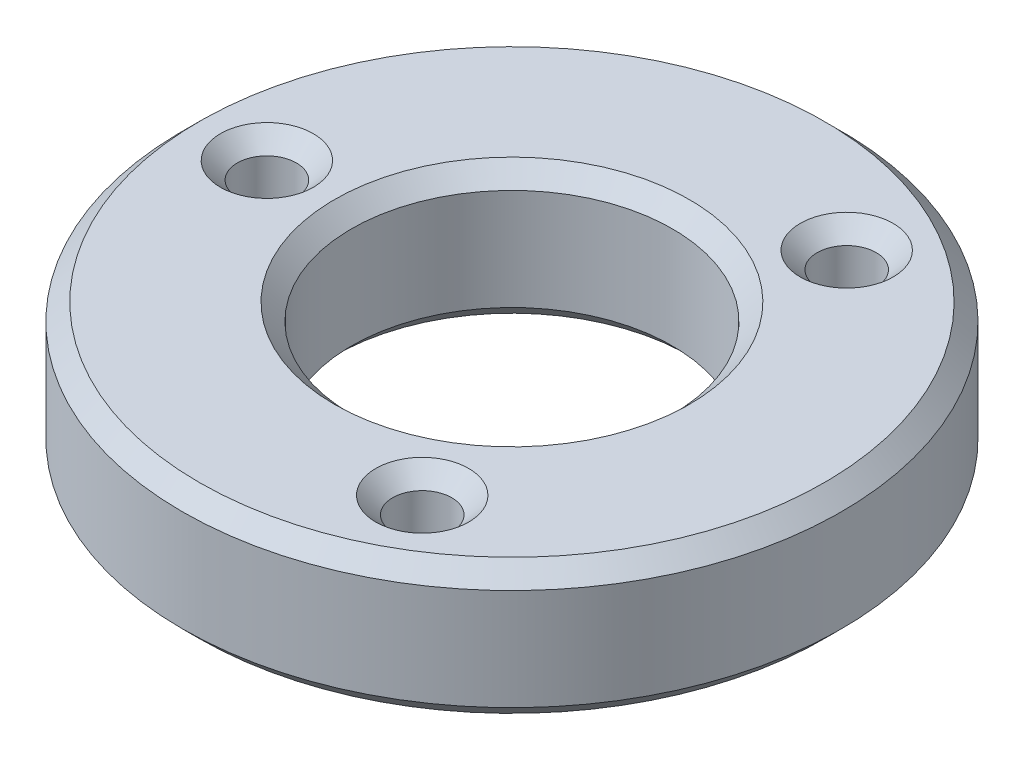
ISO-10303-21;
HEADER;
FILE_DESCRIPTION(('STEP AP214'),'2;1');
FILE_NAME('part.step','',(''),(''),'','','');
FILE_SCHEMA(('AUTOMOTIVE_DESIGN { 1 0 10303 214 1 1 1 1 }'));
ENDSEC;
DATA;
#1=APPLICATION_CONTEXT('core data for automotive mechanical design processes');
#2=APPLICATION_PROTOCOL_DEFINITION('international standard','automotive_design',2000,#1);
#3=PRODUCT_CONTEXT('',#1,'mechanical');
#4=PRODUCT('Part','Part','',(#3));
#5=PRODUCT_RELATED_PRODUCT_CATEGORY('part','',(#4));
#6=PRODUCT_DEFINITION_FORMATION('','',#4);
#7=PRODUCT_DEFINITION_CONTEXT('part definition',#1,'design');
#8=PRODUCT_DEFINITION('design','',#6,#7);
#9=PRODUCT_DEFINITION_SHAPE('','',#8);
#10=(LENGTH_UNIT() NAMED_UNIT(*) SI_UNIT(.MILLI.,.METRE.));
#11=(NAMED_UNIT(*) PLANE_ANGLE_UNIT() SI_UNIT($,.RADIAN.));
#12=(NAMED_UNIT(*) SI_UNIT($,.STERADIAN.) SOLID_ANGLE_UNIT());
#13=UNCERTAINTY_MEASURE_WITH_UNIT(LENGTH_MEASURE(1.E-05),#10,'distance_accuracy_value','');
#14=(GEOMETRIC_REPRESENTATION_CONTEXT(3) GLOBAL_UNCERTAINTY_ASSIGNED_CONTEXT((#13)) GLOBAL_UNIT_ASSIGNED_CONTEXT((#10,
#11,#12)) REPRESENTATION_CONTEXT('',''));
#15=CARTESIAN_POINT('',(0.,0.,0.));
#16=DIRECTION('',(0.,0.,1.));
#17=DIRECTION('',(1.,0.,0.));
#18=AXIS2_PLACEMENT_3D('',#15,#16,#17);
#19=CARTESIAN_POINT('',(0.,8.,0.));
#20=DIRECTION('',(0.,1.,0.));
#21=DIRECTION('',(0.,0.,1.));
#22=AXIS2_PLACEMENT_3D('',#19,#20,#21);
#23=PLANE('',#22);
#24=CARTESIAN_POINT('',(7.24999999999998,8.,12.5573683548744));
#25=DIRECTION('',(0.,1.,0.));
#26=DIRECTION('',(0.,0.,1.));
#27=AXIS2_PLACEMENT_3D('',#24,#25,#26);
#28=CIRCLE('',#27,2.75000000000005);
#29=CARTESIAN_POINT('',(7.24999999999998,8.,15.3073683548744));
#30=VERTEX_POINT('',#29);
#31=EDGE_CURVE('E10',#30,#30,#28,.F.);
#32=ORIENTED_EDGE('',*,*,#31,.T.);
#33=EDGE_LOOP('',(#32));
#34=FACE_BOUND('',#33,.T.);
#35=CARTESIAN_POINT('',(-14.5,8.,0.));
#36=DIRECTION('',(0.,1.,0.));
#37=DIRECTION('',(0.,0.,1.));
#38=AXIS2_PLACEMENT_3D('',#35,#36,#37);
#39=CIRCLE('',#38,2.75);
#40=CARTESIAN_POINT('',(-14.5,8.,2.75));
#41=VERTEX_POINT('',#40);
#42=EDGE_CURVE('E44',#41,#41,#39,.F.);
#43=ORIENTED_EDGE('',*,*,#42,.T.);
#44=EDGE_LOOP('',(#43));
#45=FACE_BOUND('',#44,.T.);
#46=CARTESIAN_POINT('',(0.,8.,0.));
#47=DIRECTION('',(0.,1.,0.));
#48=DIRECTION('',(0.,0.,1.));
#49=AXIS2_PLACEMENT_3D('',#46,#47,#48);
#50=CIRCLE('',#49,18.5);
#51=CARTESIAN_POINT('',(0.,8.,18.5));
#52=VERTEX_POINT('',#51);
#53=EDGE_CURVE('E48',#52,#52,#50,.T.);
#54=ORIENTED_EDGE('',*,*,#53,.T.);
#55=EDGE_LOOP('',(#54));
#56=FACE_BOUND('',#55,.T.);
#57=CARTESIAN_POINT('',(0.,8.,0.));
#58=DIRECTION('',(0.,1.,0.));
#59=DIRECTION('',(0.,0.,1.));
#60=AXIS2_PLACEMENT_3D('',#57,#58,#59);
#61=CIRCLE('',#60,10.5);
#62=CARTESIAN_POINT('',(0.,8.,10.5));
#63=VERTEX_POINT('',#62);
#64=EDGE_CURVE('E52',#63,#63,#61,.F.);
#65=ORIENTED_EDGE('',*,*,#64,.T.);
#66=EDGE_LOOP('',(#65));
#67=FACE_BOUND('',#66,.T.);
#68=CARTESIAN_POINT('',(7.25000000000002,8.,-12.5573683548743));
#69=DIRECTION('',(0.,1.,0.));
#70=DIRECTION('',(0.,0.,1.));
#71=AXIS2_PLACEMENT_3D('',#68,#69,#70);
#72=CIRCLE('',#71,2.75);
#73=CARTESIAN_POINT('',(7.25000000000002,8.,-9.80736835487433));
#74=VERTEX_POINT('',#73);
#75=EDGE_CURVE('E57',#74,#74,#72,.F.);
#76=ORIENTED_EDGE('',*,*,#75,.T.);
#77=EDGE_LOOP('',(#76));
#78=FACE_BOUND('',#77,.T.);
#79=ADVANCED_FACE('F36',(#34,#45,#56,#67,#78),#23,.T.);
#80=CARTESIAN_POINT('',(0.,0.,0.));
#81=DIRECTION('',(0.,1.,0.));
#82=DIRECTION('',(0.,0.,1.));
#83=AXIS2_PLACEMENT_3D('',#80,#81,#82);
#84=PLANE('',#83);
#85=CARTESIAN_POINT('',(7.24999999999998,0.,12.5573683548744));
#86=DIRECTION('',(0.,1.,0.));
#87=DIRECTION('',(0.,0.,1.));
#88=AXIS2_PLACEMENT_3D('',#85,#86,#87);
#89=CIRCLE('',#88,2.75000000000005);
#90=CARTESIAN_POINT('',(7.24999999999998,0.,15.3073683548744));
#91=VERTEX_POINT('',#90);
#92=EDGE_CURVE('E90',#91,#91,#89,.T.);
#93=ORIENTED_EDGE('',*,*,#92,.T.);
#94=EDGE_LOOP('',(#93));
#95=FACE_BOUND('',#94,.T.);
#96=CARTESIAN_POINT('',(7.25000000000002,0.,-12.5573683548743));
#97=DIRECTION('',(0.,1.,0.));
#98=DIRECTION('',(0.,0.,1.));
#99=AXIS2_PLACEMENT_3D('',#96,#97,#98);
#100=CIRCLE('',#99,2.74999999999998);
#101=CARTESIAN_POINT('',(7.25000000000002,0.,-9.80736835487434));
#102=VERTEX_POINT('',#101);
#103=EDGE_CURVE('E93',#102,#102,#100,.T.);
#104=ORIENTED_EDGE('',*,*,#103,.T.);
#105=EDGE_LOOP('',(#104));
#106=FACE_BOUND('',#105,.T.);
#107=CARTESIAN_POINT('',(-14.5,0.,0.));
#108=DIRECTION('',(0.,1.,0.));
#109=DIRECTION('',(0.,0.,1.));
#110=AXIS2_PLACEMENT_3D('',#107,#108,#109);
#111=CIRCLE('',#110,2.74999999999999);
#112=CARTESIAN_POINT('',(-14.5,0.,2.74999999999999));
#113=VERTEX_POINT('',#112);
#114=EDGE_CURVE('E96',#113,#113,#111,.T.);
#115=ORIENTED_EDGE('',*,*,#114,.T.);
#116=EDGE_LOOP('',(#115));
#117=FACE_BOUND('',#116,.T.);
#118=CARTESIAN_POINT('',(0.,0.,0.));
#119=DIRECTION('',(0.,1.,0.));
#120=DIRECTION('',(0.,0.,1.));
#121=AXIS2_PLACEMENT_3D('',#118,#119,#120);
#122=CIRCLE('',#121,10.5);
#123=CARTESIAN_POINT('',(0.,0.,10.5));
#124=VERTEX_POINT('',#123);
#125=EDGE_CURVE('E99',#124,#124,#122,.T.);
#126=ORIENTED_EDGE('',*,*,#125,.T.);
#127=EDGE_LOOP('',(#126));
#128=FACE_BOUND('',#127,.T.);
#129=CARTESIAN_POINT('',(0.,0.,0.));
#130=DIRECTION('',(0.,1.,0.));
#131=DIRECTION('',(0.,0.,1.));
#132=AXIS2_PLACEMENT_3D('',#129,#130,#131);
#133=CIRCLE('',#132,18.5);
#134=CARTESIAN_POINT('',(0.,0.,18.5));
#135=VERTEX_POINT('',#134);
#136=EDGE_CURVE('E102',#135,#135,#133,.F.);
#137=ORIENTED_EDGE('',*,*,#136,.T.);
#138=EDGE_LOOP('',(#137));
#139=FACE_BOUND('',#138,.T.);
#140=ADVANCED_FACE('F106',(#95,#106,#117,#128,#139),#84,.F.);
#141=CARTESIAN_POINT('',(0.,8.,0.));
#142=DIRECTION('',(0.,-1.,0.));
#143=DIRECTION('',(0.,0.,-1.));
#144=AXIS2_PLACEMENT_3D('',#141,#142,#143);
#145=CYLINDRICAL_SURFACE('',#144,19.5);
#146=CARTESIAN_POINT('',(0.,1.,0.));
#147=DIRECTION('',(0.,1.,0.));
#148=DIRECTION('',(0.,0.,1.));
#149=AXIS2_PLACEMENT_3D('',#146,#147,#148);
#150=CIRCLE('',#149,19.5);
#151=CARTESIAN_POINT('',(0.,1.,19.5));
#152=VERTEX_POINT('',#151);
#153=EDGE_CURVE('E60',#152,#152,#150,.T.);
#154=ORIENTED_EDGE('',*,*,#153,.T.);
#155=EDGE_LOOP('',(#154));
#156=FACE_BOUND('',#155,.T.);
#157=CARTESIAN_POINT('',(0.,6.99999999999999,0.));
#158=DIRECTION('',(0.,1.,0.));
#159=DIRECTION('',(0.,0.,1.));
#160=AXIS2_PLACEMENT_3D('',#157,#158,#159);
#161=CIRCLE('',#160,19.5);
#162=CARTESIAN_POINT('',(0.,6.99999999999999,19.5));
#163=VERTEX_POINT('',#162);
#164=EDGE_CURVE('E63',#163,#163,#161,.F.);
#165=ORIENTED_EDGE('',*,*,#164,.T.);
#166=EDGE_LOOP('',(#165));
#167=FACE_BOUND('',#166,.T.);
#168=ADVANCED_FACE('F116',(#156,#167),#145,.T.);
#169=CARTESIAN_POINT('',(0.,8.,0.));
#170=DIRECTION('',(0.,-1.,0.));
#171=DIRECTION('',(0.,0.,-1.));
#172=AXIS2_PLACEMENT_3D('',#169,#170,#171);
#173=CYLINDRICAL_SURFACE('',#172,9.5);
#174=CARTESIAN_POINT('',(0.,0.999999999999994,0.));
#175=DIRECTION('',(0.,1.,0.));
#176=DIRECTION('',(0.,0.,1.));
#177=AXIS2_PLACEMENT_3D('',#174,#175,#176);
#178=CIRCLE('',#177,9.5);
#179=CARTESIAN_POINT('',(0.,0.999999999999994,9.5));
#180=VERTEX_POINT('',#179);
#181=EDGE_CURVE('E66',#180,#180,#178,.F.);
#182=ORIENTED_EDGE('',*,*,#181,.T.);
#183=EDGE_LOOP('',(#182));
#184=FACE_BOUND('',#183,.T.);
#185=CARTESIAN_POINT('',(0.,7.,0.));
#186=DIRECTION('',(0.,1.,0.));
#187=DIRECTION('',(0.,0.,1.));
#188=AXIS2_PLACEMENT_3D('',#185,#186,#187);
#189=CIRCLE('',#188,9.5);
#190=CARTESIAN_POINT('',(0.,7.,9.5));
#191=VERTEX_POINT('',#190);
#192=EDGE_CURVE('E69',#191,#191,#189,.T.);
#193=ORIENTED_EDGE('',*,*,#192,.T.);
#194=EDGE_LOOP('',(#193));
#195=FACE_BOUND('',#194,.T.);
#196=ADVANCED_FACE('F119',(#184,#195),#173,.F.);
#197=CARTESIAN_POINT('',(-14.5,8.,0.));
#198=DIRECTION('',(0.,-1.,0.));
#199=DIRECTION('',(0.,0.,-1.));
#200=AXIS2_PLACEMENT_3D('',#197,#198,#199);
#201=CYLINDRICAL_SURFACE('',#200,1.75);
#202=CARTESIAN_POINT('',(-14.5,0.999999999999997,0.));
#203=DIRECTION('',(0.,1.,0.));
#204=DIRECTION('',(0.,0.,1.));
#205=AXIS2_PLACEMENT_3D('',#202,#203,#204);
#206=CIRCLE('',#205,1.75);
#207=CARTESIAN_POINT('',(-14.5,0.999999999999997,1.75));
#208=VERTEX_POINT('',#207);
#209=EDGE_CURVE('E72',#208,#208,#206,.F.);
#210=ORIENTED_EDGE('',*,*,#209,.T.);
#211=EDGE_LOOP('',(#210));
#212=FACE_BOUND('',#211,.T.);
#213=CARTESIAN_POINT('',(-14.5,7.,0.));
#214=DIRECTION('',(0.,1.,0.));
#215=DIRECTION('',(0.,0.,1.));
#216=AXIS2_PLACEMENT_3D('',#213,#214,#215);
#217=CIRCLE('',#216,1.75);
#218=CARTESIAN_POINT('',(-14.5,7.,1.75));
#219=VERTEX_POINT('',#218);
#220=EDGE_CURVE('E75',#219,#219,#217,.T.);
#221=ORIENTED_EDGE('',*,*,#220,.T.);
#222=EDGE_LOOP('',(#221));
#223=FACE_BOUND('',#222,.T.);
#224=ADVANCED_FACE('F145',(#212,#223),#201,.F.);
#225=CARTESIAN_POINT('',(7.25000000000002,8.,-12.5573683548743));
#226=DIRECTION('',(0.,-1.,0.));
#227=DIRECTION('',(0.,0.,-1.));
#228=AXIS2_PLACEMENT_3D('',#225,#226,#227);
#229=CYLINDRICAL_SURFACE('',#228,1.74999999999999);
#230=CARTESIAN_POINT('',(7.25000000000002,0.99999999999999,-12.5573683548743));
#231=DIRECTION('',(0.,1.,0.));
#232=DIRECTION('',(0.,0.,1.));
#233=AXIS2_PLACEMENT_3D('',#230,#231,#232);
#234=CIRCLE('',#233,1.74999999999999);
#235=CARTESIAN_POINT('',(7.25000000000002,0.99999999999999,-10.8073683548743));
#236=VERTEX_POINT('',#235);
#237=EDGE_CURVE('E78',#236,#236,#234,.F.);
#238=ORIENTED_EDGE('',*,*,#237,.T.);
#239=EDGE_LOOP('',(#238));
#240=FACE_BOUND('',#239,.T.);
#241=CARTESIAN_POINT('',(7.25000000000002,7.,-12.5573683548743));
#242=DIRECTION('',(0.,1.,0.));
#243=DIRECTION('',(0.,0.,1.));
#244=AXIS2_PLACEMENT_3D('',#241,#242,#243);
#245=CIRCLE('',#244,1.74999999999999);
#246=CARTESIAN_POINT('',(7.25000000000002,7.,-10.8073683548743));
#247=VERTEX_POINT('',#246);
#248=EDGE_CURVE('E81',#247,#247,#245,.T.);
#249=ORIENTED_EDGE('',*,*,#248,.T.);
#250=EDGE_LOOP('',(#249));
#251=FACE_BOUND('',#250,.T.);
#252=ADVANCED_FACE('F142',(#240,#251),#229,.F.);
#253=CARTESIAN_POINT('',(7.24999999999998,8.,12.5573683548744));
#254=DIRECTION('',(0.,-1.,0.));
#255=DIRECTION('',(0.,0.,-1.));
#256=AXIS2_PLACEMENT_3D('',#253,#254,#255);
#257=CYLINDRICAL_SURFACE('',#256,1.75000000000005);
#258=CARTESIAN_POINT('',(7.24999999999998,1.,12.5573683548744));
#259=DIRECTION('',(0.,1.,0.));
#260=DIRECTION('',(0.,0.,1.));
#261=AXIS2_PLACEMENT_3D('',#258,#259,#260);
#262=CIRCLE('',#261,1.75000000000005);
#263=CARTESIAN_POINT('',(7.24999999999998,1.,14.3073683548744));
#264=VERTEX_POINT('',#263);
#265=EDGE_CURVE('E84',#264,#264,#262,.F.);
#266=ORIENTED_EDGE('',*,*,#265,.T.);
#267=EDGE_LOOP('',(#266));
#268=FACE_BOUND('',#267,.T.);
#269=CARTESIAN_POINT('',(7.24999999999998,7.,12.5573683548744));
#270=DIRECTION('',(0.,1.,0.));
#271=DIRECTION('',(0.,0.,1.));
#272=AXIS2_PLACEMENT_3D('',#269,#270,#271);
#273=CIRCLE('',#272,1.75000000000005);
#274=CARTESIAN_POINT('',(7.24999999999998,7.,14.3073683548744));
#275=VERTEX_POINT('',#274);
#276=EDGE_CURVE('E87',#275,#275,#273,.T.);
#277=ORIENTED_EDGE('',*,*,#276,.T.);
#278=EDGE_LOOP('',(#277));
#279=FACE_BOUND('',#278,.T.);
#280=ADVANCED_FACE('F144',(#268,#279),#257,.F.);
#281=CARTESIAN_POINT('',(7.24999999999998,0.,12.5573683548744));
#282=DIRECTION('',(0.,-1.,0.));
#283=DIRECTION('',(0.,0.,-1.));
#284=AXIS2_PLACEMENT_3D('',#281,#282,#283);
#285=CONICAL_SURFACE('',#284,2.75000000000005,0.785398163397448);
#286=ORIENTED_EDGE('',*,*,#265,.F.);
#287=EDGE_LOOP('',(#286));
#288=FACE_BOUND('',#287,.T.);
#289=ORIENTED_EDGE('',*,*,#92,.F.);
#290=EDGE_LOOP('',(#289));
#291=FACE_BOUND('',#290,.T.);
#292=ADVANCED_FACE('F152',(#288,#291),#285,.F.);
#293=CARTESIAN_POINT('',(7.25000000000002,0.,-12.5573683548743));
#294=DIRECTION('',(0.,-1.,0.));
#295=DIRECTION('',(0.,0.,-1.));
#296=AXIS2_PLACEMENT_3D('',#293,#294,#295);
#297=CONICAL_SURFACE('',#296,2.74999999999998,0.785398163397448);
#298=ORIENTED_EDGE('',*,*,#237,.F.);
#299=EDGE_LOOP('',(#298));
#300=FACE_BOUND('',#299,.T.);
#301=ORIENTED_EDGE('',*,*,#103,.F.);
#302=EDGE_LOOP('',(#301));
#303=FACE_BOUND('',#302,.T.);
#304=ADVANCED_FACE('F170',(#300,#303),#297,.F.);
#305=CARTESIAN_POINT('',(-14.5,0.,0.));
#306=DIRECTION('',(0.,-1.,0.));
#307=DIRECTION('',(0.,0.,-1.));
#308=AXIS2_PLACEMENT_3D('',#305,#306,#307);
#309=CONICAL_SURFACE('',#308,2.74999999999999,0.785398163397444);
#310=ORIENTED_EDGE('',*,*,#209,.F.);
#311=EDGE_LOOP('',(#310));
#312=FACE_BOUND('',#311,.T.);
#313=ORIENTED_EDGE('',*,*,#114,.F.);
#314=EDGE_LOOP('',(#313));
#315=FACE_BOUND('',#314,.T.);
#316=ADVANCED_FACE('F177',(#312,#315),#309,.F.);
#317=CARTESIAN_POINT('',(0.,0.,0.));
#318=DIRECTION('',(0.,-1.,0.));
#319=DIRECTION('',(0.,0.,-1.));
#320=AXIS2_PLACEMENT_3D('',#317,#318,#319);
#321=CONICAL_SURFACE('',#320,10.5,0.785398163397447);
#322=ORIENTED_EDGE('',*,*,#181,.F.);
#323=EDGE_LOOP('',(#322));
#324=FACE_BOUND('',#323,.T.);
#325=ORIENTED_EDGE('',*,*,#125,.F.);
#326=EDGE_LOOP('',(#325));
#327=FACE_BOUND('',#326,.T.);
#328=ADVANCED_FACE('F112',(#324,#327),#321,.F.);
#329=CARTESIAN_POINT('',(0.,1.,0.));
#330=DIRECTION('',(0.,1.,0.));
#331=DIRECTION('',(0.,0.,1.));
#332=AXIS2_PLACEMENT_3D('',#329,#330,#331);
#333=CONICAL_SURFACE('',#332,19.5,0.785398163397448);
#334=ORIENTED_EDGE('',*,*,#136,.F.);
#335=EDGE_LOOP('',(#334));
#336=FACE_BOUND('',#335,.T.);
#337=ORIENTED_EDGE('',*,*,#153,.F.);
#338=EDGE_LOOP('',(#337));
#339=FACE_BOUND('',#338,.T.);
#340=ADVANCED_FACE('F108',(#336,#339),#333,.T.);
#341=CARTESIAN_POINT('',(7.24999999999998,7.,12.5573683548744));
#342=DIRECTION('',(0.,1.,0.));
#343=DIRECTION('',(0.,0.,1.));
#344=AXIS2_PLACEMENT_3D('',#341,#342,#343);
#345=CONICAL_SURFACE('',#344,1.75000000000005,0.785398163397449);
#346=ORIENTED_EDGE('',*,*,#31,.F.);
#347=EDGE_LOOP('',(#346));
#348=FACE_BOUND('',#347,.T.);
#349=ORIENTED_EDGE('',*,*,#276,.F.);
#350=EDGE_LOOP('',(#349));
#351=FACE_BOUND('',#350,.T.);
#352=ADVANCED_FACE('F111',(#348,#351),#345,.F.);
#353=CARTESIAN_POINT('',(-14.5,7.,0.));
#354=DIRECTION('',(0.,1.,0.));
#355=DIRECTION('',(0.,0.,1.));
#356=AXIS2_PLACEMENT_3D('',#353,#354,#355);
#357=CONICAL_SURFACE('',#356,1.75,0.785398163397449);
#358=ORIENTED_EDGE('',*,*,#42,.F.);
#359=EDGE_LOOP('',(#358));
#360=FACE_BOUND('',#359,.T.);
#361=ORIENTED_EDGE('',*,*,#220,.F.);
#362=EDGE_LOOP('',(#361));
#363=FACE_BOUND('',#362,.T.);
#364=ADVANCED_FACE('F127',(#360,#363),#357,.F.);
#365=CARTESIAN_POINT('',(0.,8.,0.));
#366=DIRECTION('',(0.,-1.,0.));
#367=DIRECTION('',(0.,0.,-1.));
#368=AXIS2_PLACEMENT_3D('',#365,#366,#367);
#369=CONICAL_SURFACE('',#368,18.5,0.78539816339745);
#370=ORIENTED_EDGE('',*,*,#164,.F.);
#371=EDGE_LOOP('',(#370));
#372=FACE_BOUND('',#371,.T.);
#373=ORIENTED_EDGE('',*,*,#53,.F.);
#374=EDGE_LOOP('',(#373));
#375=FACE_BOUND('',#374,.T.);
#376=ADVANCED_FACE('F123',(#372,#375),#369,.T.);
#377=CARTESIAN_POINT('',(0.,7.,0.));
#378=DIRECTION('',(0.,1.,0.));
#379=DIRECTION('',(0.,0.,1.));
#380=AXIS2_PLACEMENT_3D('',#377,#378,#379);
#381=CONICAL_SURFACE('',#380,9.5,0.785398163397449);
#382=ORIENTED_EDGE('',*,*,#64,.F.);
#383=EDGE_LOOP('',(#382));
#384=FACE_BOUND('',#383,.T.);
#385=ORIENTED_EDGE('',*,*,#192,.F.);
#386=EDGE_LOOP('',(#385));
#387=FACE_BOUND('',#386,.T.);
#388=ADVANCED_FACE('F126',(#384,#387),#381,.F.);
#389=CARTESIAN_POINT('',(7.25000000000002,7.,-12.5573683548743));
#390=DIRECTION('',(0.,1.,0.));
#391=DIRECTION('',(0.,0.,1.));
#392=AXIS2_PLACEMENT_3D('',#389,#390,#391);
#393=CONICAL_SURFACE('',#392,1.74999999999999,0.785398163397452);
#394=ORIENTED_EDGE('',*,*,#75,.F.);
#395=EDGE_LOOP('',(#394));
#396=FACE_BOUND('',#395,.T.);
#397=ORIENTED_EDGE('',*,*,#248,.F.);
#398=EDGE_LOOP('',(#397));
#399=FACE_BOUND('',#398,.T.);
#400=ADVANCED_FACE('F39',(#396,#399),#393,.F.);
#401=CLOSED_SHELL('',(#79,#140,#168,#196,#224,#252,#280,#292,#304,#316,#328,#340,#352,#364,#376,
#388,#400));
#402=MANIFOLD_SOLID_BREP('B2',#401);
#403=ADVANCED_BREP_SHAPE_REPRESENTATION('',(#18,#402),#14);
#404=SHAPE_DEFINITION_REPRESENTATION(#9,#403);
ENDSEC;
END-ISO-10303-21;
